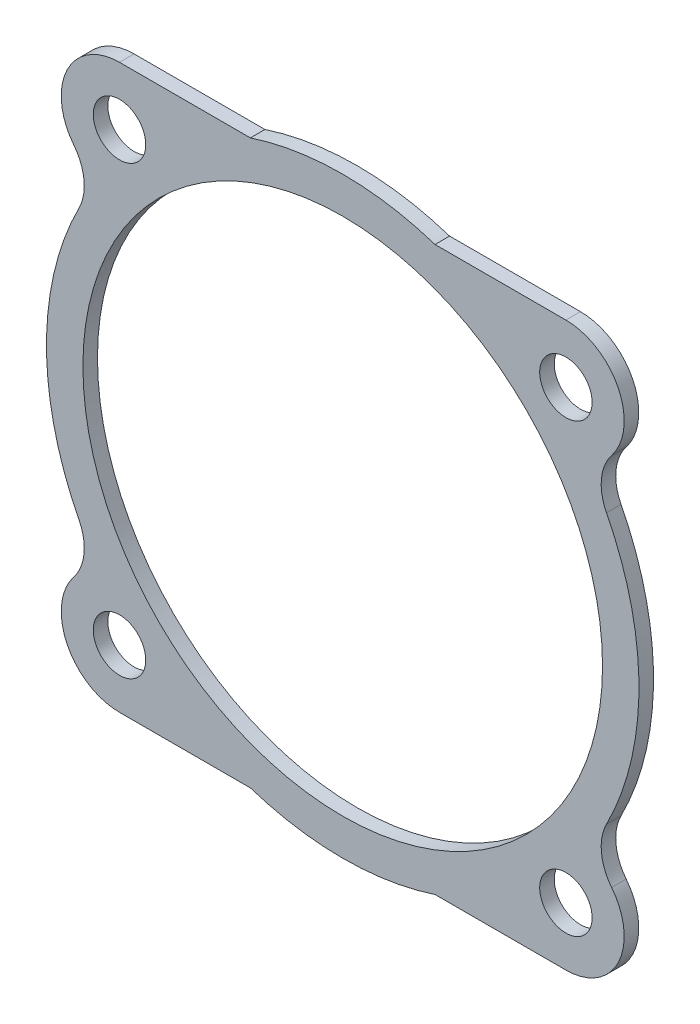
ISO-10303-21;
HEADER;
FILE_DESCRIPTION(('STEP AP214'),'2;1');
FILE_NAME('part.step','',(''),(''),'','','');
FILE_SCHEMA(('AUTOMOTIVE_DESIGN { 1 0 10303 214 1 1 1 1 }'));
ENDSEC;
DATA;
#1=APPLICATION_CONTEXT('core data for automotive mechanical design processes');
#2=APPLICATION_PROTOCOL_DEFINITION('international standard','automotive_design',2000,#1);
#3=PRODUCT_CONTEXT('',#1,'mechanical');
#4=PRODUCT('Part','Part','',(#3));
#5=PRODUCT_RELATED_PRODUCT_CATEGORY('part','',(#4));
#6=PRODUCT_DEFINITION_FORMATION('','',#4);
#7=PRODUCT_DEFINITION_CONTEXT('part definition',#1,'design');
#8=PRODUCT_DEFINITION('design','',#6,#7);
#9=PRODUCT_DEFINITION_SHAPE('','',#8);
#10=(LENGTH_UNIT() NAMED_UNIT(*) SI_UNIT(.MILLI.,.METRE.));
#11=(NAMED_UNIT(*) PLANE_ANGLE_UNIT() SI_UNIT($,.RADIAN.));
#12=(NAMED_UNIT(*) SI_UNIT($,.STERADIAN.) SOLID_ANGLE_UNIT());
#13=UNCERTAINTY_MEASURE_WITH_UNIT(LENGTH_MEASURE(1.E-05),#10,'distance_accuracy_value','');
#14=(GEOMETRIC_REPRESENTATION_CONTEXT(3) GLOBAL_UNCERTAINTY_ASSIGNED_CONTEXT((#13)) GLOBAL_UNIT_ASSIGNED_CONTEXT((#10,
#11,#12)) REPRESENTATION_CONTEXT('',''));
#15=CARTESIAN_POINT('',(0.,0.,0.));
#16=DIRECTION('',(0.,0.,1.));
#17=DIRECTION('',(1.,0.,0.));
#18=AXIS2_PLACEMENT_3D('',#15,#16,#17);
#19=CARTESIAN_POINT('',(0.,0.,0.750000000000001));
#20=DIRECTION('',(0.,0.,1.));
#21=DIRECTION('',(1.,0.,0.));
#22=AXIS2_PLACEMENT_3D('',#19,#20,#21);
#23=PLANE('',#22);
#24=CARTESIAN_POINT('',(11.4904851942815,11.4904851942813,0.750000000000006));
#25=DIRECTION('',(0.,0.,1.));
#26=DIRECTION('',(1.,0.,0.));
#27=AXIS2_PLACEMENT_3D('',#24,#25,#26);
#28=CIRCLE('',#27,1.35);
#29=CARTESIAN_POINT('',(12.8404851942815,11.4904851942813,0.750000000000006));
#30=VERTEX_POINT('',#29);
#31=EDGE_CURVE('E379',#30,#30,#28,.T.);
#32=ORIENTED_EDGE('',*,*,#31,.F.);
#33=EDGE_LOOP('',(#32));
#34=FACE_BOUND('',#33,.T.);
#35=CARTESIAN_POINT('',(-11.4904851942815,-11.4904851942813,0.749999999999995));
#36=DIRECTION('',(0.,0.,1.));
#37=DIRECTION('',(1.,0.,0.));
#38=AXIS2_PLACEMENT_3D('',#35,#36,#37);
#39=CIRCLE('',#38,1.35);
#40=CARTESIAN_POINT('',(-10.1404851942815,-11.4904851942813,0.749999999999995));
#41=VERTEX_POINT('',#40);
#42=EDGE_CURVE('E391',#41,#41,#39,.T.);
#43=ORIENTED_EDGE('',*,*,#42,.F.);
#44=EDGE_LOOP('',(#43));
#45=FACE_BOUND('',#44,.T.);
#46=CARTESIAN_POINT('',(0.,0.,0.750000000000001));
#47=DIRECTION('',(0.,0.,1.));
#48=DIRECTION('',(1.,0.,0.));
#49=AXIS2_PLACEMENT_3D('',#46,#47,#48);
#50=CIRCLE('',#49,15.25);
#51=CARTESIAN_POINT('',(4.75271909903301,14.4904851942813,0.750000000000001));
#52=VERTEX_POINT('',#51);
#53=CARTESIAN_POINT('',(-4.75271909903301,14.4904851942813,0.750000000000001));
#54=VERTEX_POINT('',#53);
#55=EDGE_CURVE('E196',#52,#54,#50,.T.);
#56=ORIENTED_EDGE('',*,*,#55,.T.);
#57=DIRECTION('',(-1.,0.,0.));
#58=VECTOR('',#57,1.);
#59=CARTESIAN_POINT('',(-4.75271909903301,14.4904851942813,0.750000000000001));
#60=LINE('',#59,#58);
#61=CARTESIAN_POINT('',(-11.4904851942815,14.4904851942813,0.750000000000001));
#62=VERTEX_POINT('',#61);
#63=EDGE_CURVE('E159',#54,#62,#60,.T.);
#64=ORIENTED_EDGE('',*,*,#63,.T.);
#65=CARTESIAN_POINT('',(-11.4904851942815,11.4904851942813,0.750000000000001));
#66=DIRECTION('',(0.,0.,1.));
#67=DIRECTION('',(1.,0.,0.));
#68=AXIS2_PLACEMENT_3D('',#65,#66,#67);
#69=CIRCLE('',#68,3.);
#70=CARTESIAN_POINT('',(-13.8437153322599,9.62975740180065,0.750000000000001));
#71=VERTEX_POINT('',#70);
#72=EDGE_CURVE('E199',#62,#71,#69,.T.);
#73=ORIENTED_EDGE('',*,*,#72,.T.);
#74=CARTESIAN_POINT('',(-15.8047404472421,8.07915090806675,0.750000000000001));
#75=DIRECTION('',(0.,0.,-1.));
#76=DIRECTION('',(1.,0.,0.));
#77=AXIS2_PLACEMENT_3D('',#74,#75,#76);
#78=CIRCLE('',#77,2.5);
#79=CARTESIAN_POINT('',(-13.5787206659402,6.9412423294658,0.750000000000001));
#80=VERTEX_POINT('',#79);
#81=EDGE_CURVE('E201',#71,#80,#78,.T.);
#82=ORIENTED_EDGE('',*,*,#81,.T.);
#83=CARTESIAN_POINT('',(0.,0.,0.750000000000001));
#84=DIRECTION('',(0.,0.,1.));
#85=DIRECTION('',(1.,0.,0.));
#86=AXIS2_PLACEMENT_3D('',#83,#84,#85);
#87=CIRCLE('',#86,15.25);
#88=CARTESIAN_POINT('',(-13.5787206659402,-6.9412423294658,0.750000000000001));
#89=VERTEX_POINT('',#88);
#90=EDGE_CURVE('E203',#80,#89,#87,.T.);
#91=ORIENTED_EDGE('',*,*,#90,.T.);
#92=CARTESIAN_POINT('',(-15.8047404472421,-8.07915090806676,0.750000000000001));
#93=DIRECTION('',(0.,0.,-1.));
#94=DIRECTION('',(1.,0.,0.));
#95=AXIS2_PLACEMENT_3D('',#92,#93,#94);
#96=CIRCLE('',#95,2.5);
#97=CARTESIAN_POINT('',(-13.8437153322599,-9.62975740180066,0.750000000000001));
#98=VERTEX_POINT('',#97);
#99=EDGE_CURVE('E205',#89,#98,#96,.T.);
#100=ORIENTED_EDGE('',*,*,#99,.T.);
#101=CARTESIAN_POINT('',(-11.4904851942815,-11.4904851942813,0.749999999999995));
#102=DIRECTION('',(0.,0.,1.));
#103=DIRECTION('',(1.,0.,0.));
#104=AXIS2_PLACEMENT_3D('',#101,#102,#103);
#105=CIRCLE('',#104,3.);
#106=CARTESIAN_POINT('',(-11.4904851942815,-14.4904851942813,0.750000000000001));
#107=VERTEX_POINT('',#106);
#108=EDGE_CURVE('E207',#98,#107,#105,.T.);
#109=ORIENTED_EDGE('',*,*,#108,.T.);
#110=DIRECTION('',(1.,0.,0.));
#111=VECTOR('',#110,1.);
#112=CARTESIAN_POINT('',(-11.4904851942815,-14.4904851942813,0.750000000000001));
#113=LINE('',#112,#111);
#114=CARTESIAN_POINT('',(-4.75271909903302,-14.4904851942813,0.750000000000001));
#115=VERTEX_POINT('',#114);
#116=EDGE_CURVE('E209',#107,#115,#113,.T.);
#117=ORIENTED_EDGE('',*,*,#116,.T.);
#118=CARTESIAN_POINT('',(0.,0.,0.750000000000001));
#119=DIRECTION('',(0.,0.,1.));
#120=DIRECTION('',(1.,0.,0.));
#121=AXIS2_PLACEMENT_3D('',#118,#119,#120);
#122=CIRCLE('',#121,15.25);
#123=CARTESIAN_POINT('',(4.75271909903301,-14.4904851942813,0.750000000000001));
#124=VERTEX_POINT('',#123);
#125=EDGE_CURVE('E211',#115,#124,#122,.T.);
#126=ORIENTED_EDGE('',*,*,#125,.T.);
#127=DIRECTION('',(1.,0.,0.));
#128=VECTOR('',#127,1.);
#129=CARTESIAN_POINT('',(4.75271909903301,-14.4904851942813,0.750000000000001));
#130=LINE('',#129,#128);
#131=CARTESIAN_POINT('',(11.4904851942815,-14.4904851942813,0.750000000000001));
#132=VERTEX_POINT('',#131);
#133=EDGE_CURVE('E213',#124,#132,#130,.T.);
#134=ORIENTED_EDGE('',*,*,#133,.T.);
#135=CARTESIAN_POINT('',(11.4904851942815,-11.4904851942813,0.750000000000001));
#136=DIRECTION('',(0.,0.,1.));
#137=DIRECTION('',(1.,0.,0.));
#138=AXIS2_PLACEMENT_3D('',#135,#136,#137);
#139=CIRCLE('',#138,3.);
#140=CARTESIAN_POINT('',(13.8437153322599,-9.62975740180066,0.750000000000001));
#141=VERTEX_POINT('',#140);
#142=EDGE_CURVE('E215',#132,#141,#139,.T.);
#143=ORIENTED_EDGE('',*,*,#142,.T.);
#144=CARTESIAN_POINT('',(15.8047404472417,-8.07915090806676,0.750000000000001));
#145=DIRECTION('',(0.,0.,-1.));
#146=DIRECTION('',(1.,0.,0.));
#147=AXIS2_PLACEMENT_3D('',#144,#145,#146);
#148=CIRCLE('',#147,2.5);
#149=CARTESIAN_POINT('',(13.5787206659402,-6.9412423294658,0.750000000000001));
#150=VERTEX_POINT('',#149);
#151=EDGE_CURVE('E217',#141,#150,#148,.T.);
#152=ORIENTED_EDGE('',*,*,#151,.T.);
#153=CARTESIAN_POINT('',(0.,0.,0.750000000000001));
#154=DIRECTION('',(0.,0.,1.));
#155=DIRECTION('',(1.,0.,0.));
#156=AXIS2_PLACEMENT_3D('',#153,#154,#155);
#157=CIRCLE('',#156,15.25);
#158=CARTESIAN_POINT('',(13.5787206659402,6.9412423294658,0.750000000000001));
#159=VERTEX_POINT('',#158);
#160=EDGE_CURVE('E219',#150,#159,#157,.T.);
#161=ORIENTED_EDGE('',*,*,#160,.T.);
#162=CARTESIAN_POINT('',(15.8047404472417,8.07915090806675,0.750000000000001));
#163=DIRECTION('',(0.,0.,-1.));
#164=DIRECTION('',(1.,0.,0.));
#165=AXIS2_PLACEMENT_3D('',#162,#163,#164);
#166=CIRCLE('',#165,2.5);
#167=CARTESIAN_POINT('',(13.8437153322599,9.62975740180066,0.750000000000001));
#168=VERTEX_POINT('',#167);
#169=EDGE_CURVE('E221',#159,#168,#166,.T.);
#170=ORIENTED_EDGE('',*,*,#169,.T.);
#171=CARTESIAN_POINT('',(11.4904851942815,11.4904851942813,0.750000000000006));
#172=DIRECTION('',(0.,0.,1.));
#173=DIRECTION('',(1.,0.,0.));
#174=AXIS2_PLACEMENT_3D('',#171,#172,#173);
#175=CIRCLE('',#174,3.);
#176=CARTESIAN_POINT('',(11.4904851942815,14.4904851942813,0.750000000000001));
#177=VERTEX_POINT('',#176);
#178=EDGE_CURVE('E52',#168,#177,#175,.T.);
#179=ORIENTED_EDGE('',*,*,#178,.T.);
#180=DIRECTION('',(-1.,0.,0.));
#181=VECTOR('',#180,1.);
#182=CARTESIAN_POINT('',(11.4904851942815,14.4904851942813,0.750000000000001));
#183=LINE('',#182,#181);
#184=EDGE_CURVE('E47',#177,#52,#183,.T.);
#185=ORIENTED_EDGE('',*,*,#184,.T.);
#186=EDGE_LOOP('',(#56,#64,#73,#82,#91,#100,#109,#117,#126,#134,#143,#152,#161,#170,#179,#185));
#187=FACE_BOUND('',#186,.T.);
#188=CARTESIAN_POINT('',(0.,0.,0.750000000000001));
#189=DIRECTION('',(0.,0.,1.));
#190=DIRECTION('',(1.,0.,0.));
#191=AXIS2_PLACEMENT_3D('',#188,#189,#190);
#192=CIRCLE('',#191,13.375);
#193=CARTESIAN_POINT('',(13.375,0.,0.750000000000001));
#194=VERTEX_POINT('',#193);
#195=EDGE_CURVE('E153',#194,#194,#192,.T.);
#196=ORIENTED_EDGE('',*,*,#195,.F.);
#197=EDGE_LOOP('',(#196));
#198=FACE_BOUND('',#197,.T.);
#199=CARTESIAN_POINT('',(-11.4904851942815,11.4904851942813,0.750000000000001));
#200=DIRECTION('',(0.,0.,1.));
#201=DIRECTION('',(1.,0.,0.));
#202=AXIS2_PLACEMENT_3D('',#199,#200,#201);
#203=CIRCLE('',#202,1.35);
#204=CARTESIAN_POINT('',(-10.1404851942815,11.4904851942813,0.750000000000001));
#205=VERTEX_POINT('',#204);
#206=EDGE_CURVE('E385',#205,#205,#203,.T.);
#207=ORIENTED_EDGE('',*,*,#206,.F.);
#208=EDGE_LOOP('',(#207));
#209=FACE_BOUND('',#208,.T.);
#210=CARTESIAN_POINT('',(11.4904851942815,-11.4904851942813,0.750000000000001));
#211=DIRECTION('',(0.,0.,1.));
#212=DIRECTION('',(1.,0.,0.));
#213=AXIS2_PLACEMENT_3D('',#210,#211,#212);
#214=CIRCLE('',#213,1.35);
#215=CARTESIAN_POINT('',(12.8404851942815,-11.4904851942813,0.750000000000001));
#216=VERTEX_POINT('',#215);
#217=EDGE_CURVE('E368',#216,#216,#214,.T.);
#218=ORIENTED_EDGE('',*,*,#217,.F.);
#219=EDGE_LOOP('',(#218));
#220=FACE_BOUND('',#219,.T.);
#221=ADVANCED_FACE('F32',(#34,#45,#187,#198,#209,#220),#23,.T.);
#222=CARTESIAN_POINT('',(0.,0.,0.));
#223=DIRECTION('',(0.,0.,1.));
#224=DIRECTION('',(1.,0.,0.));
#225=AXIS2_PLACEMENT_3D('',#222,#223,#224);
#226=PLANE('',#225);
#227=CARTESIAN_POINT('',(11.4904851942815,11.4904851942813,0.));
#228=DIRECTION('',(0.,0.,1.));
#229=DIRECTION('',(1.,0.,0.));
#230=AXIS2_PLACEMENT_3D('',#227,#228,#229);
#231=CIRCLE('',#230,1.35);
#232=CARTESIAN_POINT('',(12.8404851942815,11.4904851942813,0.));
#233=VERTEX_POINT('',#232);
#234=EDGE_CURVE('E374',#233,#233,#231,.T.);
#235=ORIENTED_EDGE('',*,*,#234,.T.);
#236=EDGE_LOOP('',(#235));
#237=FACE_BOUND('',#236,.T.);
#238=CARTESIAN_POINT('',(-11.4904851942815,-11.4904851942813,0.));
#239=DIRECTION('',(0.,0.,1.));
#240=DIRECTION('',(1.,0.,0.));
#241=AXIS2_PLACEMENT_3D('',#238,#239,#240);
#242=CIRCLE('',#241,1.35);
#243=CARTESIAN_POINT('',(-10.1404851942815,-11.4904851942813,0.));
#244=VERTEX_POINT('',#243);
#245=EDGE_CURVE('E388',#244,#244,#242,.T.);
#246=ORIENTED_EDGE('',*,*,#245,.T.);
#247=EDGE_LOOP('',(#246));
#248=FACE_BOUND('',#247,.T.);
#249=CARTESIAN_POINT('',(0.,0.,0.));
#250=DIRECTION('',(0.,0.,1.));
#251=DIRECTION('',(1.,0.,0.));
#252=AXIS2_PLACEMENT_3D('',#249,#250,#251);
#253=CIRCLE('',#252,15.25);
#254=CARTESIAN_POINT('',(4.75271909903301,14.4904851942813,0.));
#255=VERTEX_POINT('',#254);
#256=CARTESIAN_POINT('',(-4.75271909903301,14.4904851942813,0.));
#257=VERTEX_POINT('',#256);
#258=EDGE_CURVE('E144',#255,#257,#253,.T.);
#259=ORIENTED_EDGE('',*,*,#258,.F.);
#260=DIRECTION('',(-1.,0.,0.));
#261=VECTOR('',#260,1.);
#262=CARTESIAN_POINT('',(11.4904851942815,14.4904851942813,0.));
#263=LINE('',#262,#261);
#264=CARTESIAN_POINT('',(11.4904851942815,14.4904851942813,0.));
#265=VERTEX_POINT('',#264);
#266=EDGE_CURVE('E194',#265,#255,#263,.T.);
#267=ORIENTED_EDGE('',*,*,#266,.F.);
#268=CARTESIAN_POINT('',(11.4904851942815,11.4904851942813,0.));
#269=DIRECTION('',(0.,0.,1.));
#270=DIRECTION('',(1.,0.,0.));
#271=AXIS2_PLACEMENT_3D('',#268,#269,#270);
#272=CIRCLE('',#271,3.);
#273=CARTESIAN_POINT('',(13.8437153322599,9.62975740180066,0.));
#274=VERTEX_POINT('',#273);
#275=EDGE_CURVE('E192',#274,#265,#272,.T.);
#276=ORIENTED_EDGE('',*,*,#275,.F.);
#277=CARTESIAN_POINT('',(15.8047404472417,8.07915090806675,0.));
#278=DIRECTION('',(0.,0.,-1.));
#279=DIRECTION('',(1.,0.,0.));
#280=AXIS2_PLACEMENT_3D('',#277,#278,#279);
#281=CIRCLE('',#280,2.5);
#282=CARTESIAN_POINT('',(13.5787206659402,6.9412423294658,0.));
#283=VERTEX_POINT('',#282);
#284=EDGE_CURVE('E190',#283,#274,#281,.T.);
#285=ORIENTED_EDGE('',*,*,#284,.F.);
#286=CARTESIAN_POINT('',(0.,0.,0.));
#287=DIRECTION('',(0.,0.,1.));
#288=DIRECTION('',(1.,0.,0.));
#289=AXIS2_PLACEMENT_3D('',#286,#287,#288);
#290=CIRCLE('',#289,15.25);
#291=CARTESIAN_POINT('',(13.5787206659402,-6.9412423294658,0.));
#292=VERTEX_POINT('',#291);
#293=EDGE_CURVE('E188',#292,#283,#290,.T.);
#294=ORIENTED_EDGE('',*,*,#293,.F.);
#295=CARTESIAN_POINT('',(15.8047404472417,-8.07915090806676,0.));
#296=DIRECTION('',(0.,0.,-1.));
#297=DIRECTION('',(1.,0.,0.));
#298=AXIS2_PLACEMENT_3D('',#295,#296,#297);
#299=CIRCLE('',#298,2.5);
#300=CARTESIAN_POINT('',(13.8437153322599,-9.62975740180066,0.));
#301=VERTEX_POINT('',#300);
#302=EDGE_CURVE('E186',#301,#292,#299,.T.);
#303=ORIENTED_EDGE('',*,*,#302,.F.);
#304=CARTESIAN_POINT('',(11.4904851942815,-11.4904851942813,0.));
#305=DIRECTION('',(0.,0.,1.));
#306=DIRECTION('',(1.,0.,0.));
#307=AXIS2_PLACEMENT_3D('',#304,#305,#306);
#308=CIRCLE('',#307,3.);
#309=CARTESIAN_POINT('',(11.4904851942815,-14.4904851942813,0.));
#310=VERTEX_POINT('',#309);
#311=EDGE_CURVE('E184',#310,#301,#308,.T.);
#312=ORIENTED_EDGE('',*,*,#311,.F.);
#313=DIRECTION('',(1.,0.,0.));
#314=VECTOR('',#313,1.);
#315=CARTESIAN_POINT('',(4.75271909903301,-14.4904851942813,0.));
#316=LINE('',#315,#314);
#317=CARTESIAN_POINT('',(4.75271909903301,-14.4904851942813,0.));
#318=VERTEX_POINT('',#317);
#319=EDGE_CURVE('E182',#318,#310,#316,.T.);
#320=ORIENTED_EDGE('',*,*,#319,.F.);
#321=CARTESIAN_POINT('',(0.,0.,0.));
#322=DIRECTION('',(0.,0.,1.));
#323=DIRECTION('',(1.,0.,0.));
#324=AXIS2_PLACEMENT_3D('',#321,#322,#323);
#325=CIRCLE('',#324,15.25);
#326=CARTESIAN_POINT('',(-4.75271909903302,-14.4904851942813,0.));
#327=VERTEX_POINT('',#326);
#328=EDGE_CURVE('E180',#327,#318,#325,.T.);
#329=ORIENTED_EDGE('',*,*,#328,.F.);
#330=DIRECTION('',(1.,0.,0.));
#331=VECTOR('',#330,1.);
#332=CARTESIAN_POINT('',(-11.4904851942815,-14.4904851942813,0.));
#333=LINE('',#332,#331);
#334=CARTESIAN_POINT('',(-11.4904851942815,-14.4904851942813,0.));
#335=VERTEX_POINT('',#334);
#336=EDGE_CURVE('E178',#335,#327,#333,.T.);
#337=ORIENTED_EDGE('',*,*,#336,.F.);
#338=CARTESIAN_POINT('',(-11.4904851942815,-11.4904851942813,0.));
#339=DIRECTION('',(0.,0.,1.));
#340=DIRECTION('',(1.,0.,0.));
#341=AXIS2_PLACEMENT_3D('',#338,#339,#340);
#342=CIRCLE('',#341,3.);
#343=CARTESIAN_POINT('',(-13.8437153322599,-9.62975740180066,0.));
#344=VERTEX_POINT('',#343);
#345=EDGE_CURVE('E176',#344,#335,#342,.T.);
#346=ORIENTED_EDGE('',*,*,#345,.F.);
#347=CARTESIAN_POINT('',(-15.8047404472421,-8.07915090806676,0.));
#348=DIRECTION('',(0.,0.,-1.));
#349=DIRECTION('',(1.,0.,0.));
#350=AXIS2_PLACEMENT_3D('',#347,#348,#349);
#351=CIRCLE('',#350,2.5);
#352=CARTESIAN_POINT('',(-13.5787206659402,-6.9412423294658,0.));
#353=VERTEX_POINT('',#352);
#354=EDGE_CURVE('E174',#353,#344,#351,.T.);
#355=ORIENTED_EDGE('',*,*,#354,.F.);
#356=CARTESIAN_POINT('',(0.,0.,0.));
#357=DIRECTION('',(0.,0.,1.));
#358=DIRECTION('',(1.,0.,0.));
#359=AXIS2_PLACEMENT_3D('',#356,#357,#358);
#360=CIRCLE('',#359,15.25);
#361=CARTESIAN_POINT('',(-13.5787206659402,6.9412423294658,0.));
#362=VERTEX_POINT('',#361);
#363=EDGE_CURVE('E172',#362,#353,#360,.T.);
#364=ORIENTED_EDGE('',*,*,#363,.F.);
#365=CARTESIAN_POINT('',(-15.8047404472421,8.07915090806675,0.));
#366=DIRECTION('',(0.,0.,-1.));
#367=DIRECTION('',(1.,0.,0.));
#368=AXIS2_PLACEMENT_3D('',#365,#366,#367);
#369=CIRCLE('',#368,2.5);
#370=CARTESIAN_POINT('',(-13.8437153322599,9.62975740180065,0.));
#371=VERTEX_POINT('',#370);
#372=EDGE_CURVE('E166',#371,#362,#369,.T.);
#373=ORIENTED_EDGE('',*,*,#372,.F.);
#374=CARTESIAN_POINT('',(-11.4904851942815,11.4904851942813,0.));
#375=DIRECTION('',(0.,0.,1.));
#376=DIRECTION('',(1.,0.,0.));
#377=AXIS2_PLACEMENT_3D('',#374,#375,#376);
#378=CIRCLE('',#377,3.);
#379=CARTESIAN_POINT('',(-11.4904851942815,14.4904851942813,0.));
#380=VERTEX_POINT('',#379);
#381=EDGE_CURVE('E164',#380,#371,#378,.T.);
#382=ORIENTED_EDGE('',*,*,#381,.F.);
#383=DIRECTION('',(-1.,0.,0.));
#384=VECTOR('',#383,1.);
#385=CARTESIAN_POINT('',(-4.75271909903301,14.4904851942813,0.));
#386=LINE('',#385,#384);
#387=EDGE_CURVE('E152',#257,#380,#386,.T.);
#388=ORIENTED_EDGE('',*,*,#387,.F.);
#389=EDGE_LOOP('',(#259,#267,#276,#285,#294,#303,#312,#320,#329,#337,#346,#355,#364,#373,#382,#388));
#390=FACE_BOUND('',#389,.T.);
#391=CARTESIAN_POINT('',(0.,0.,0.));
#392=DIRECTION('',(0.,0.,1.));
#393=DIRECTION('',(1.,0.,0.));
#394=AXIS2_PLACEMENT_3D('',#391,#392,#393);
#395=CIRCLE('',#394,13.375);
#396=CARTESIAN_POINT('',(13.375,0.,0.));
#397=VERTEX_POINT('',#396);
#398=EDGE_CURVE('E394',#397,#397,#395,.T.);
#399=ORIENTED_EDGE('',*,*,#398,.T.);
#400=EDGE_LOOP('',(#399));
#401=FACE_BOUND('',#400,.T.);
#402=CARTESIAN_POINT('',(-11.4904851942815,11.4904851942813,0.));
#403=DIRECTION('',(0.,0.,1.));
#404=DIRECTION('',(1.,0.,0.));
#405=AXIS2_PLACEMENT_3D('',#402,#403,#404);
#406=CIRCLE('',#405,1.35);
#407=CARTESIAN_POINT('',(-10.1404851942815,11.4904851942813,0.));
#408=VERTEX_POINT('',#407);
#409=EDGE_CURVE('E382',#408,#408,#406,.T.);
#410=ORIENTED_EDGE('',*,*,#409,.T.);
#411=EDGE_LOOP('',(#410));
#412=FACE_BOUND('',#411,.T.);
#413=CARTESIAN_POINT('',(11.4904851942815,-11.4904851942813,0.));
#414=DIRECTION('',(0.,0.,1.));
#415=DIRECTION('',(1.,0.,0.));
#416=AXIS2_PLACEMENT_3D('',#413,#414,#415);
#417=CIRCLE('',#416,1.35);
#418=CARTESIAN_POINT('',(12.8404851942815,-11.4904851942813,0.));
#419=VERTEX_POINT('',#418);
#420=EDGE_CURVE('E371',#419,#419,#417,.T.);
#421=ORIENTED_EDGE('',*,*,#420,.T.);
#422=EDGE_LOOP('',(#421));
#423=FACE_BOUND('',#422,.T.);
#424=ADVANCED_FACE('F161',(#237,#248,#390,#401,#412,#423),#226,.F.);
#425=CARTESIAN_POINT('',(0.,0.,0.750000000000001));
#426=DIRECTION('',(0.,0.,-1.));
#427=DIRECTION('',(-1.,0.,0.));
#428=AXIS2_PLACEMENT_3D('',#425,#426,#427);
#429=CYLINDRICAL_SURFACE('',#428,15.25);
#430=ORIENTED_EDGE('',*,*,#258,.T.);
#431=DIRECTION('',(0.,0.,-1.));
#432=VECTOR('',#431,1.);
#433=CARTESIAN_POINT('',(-4.75271909903301,14.4904851942813,0.750000000000001));
#434=LINE('',#433,#432);
#435=EDGE_CURVE('E11',#54,#257,#434,.T.);
#436=ORIENTED_EDGE('',*,*,#435,.F.);
#437=ORIENTED_EDGE('',*,*,#55,.F.);
#438=DIRECTION('',(0.,0.,-1.));
#439=VECTOR('',#438,1.);
#440=CARTESIAN_POINT('',(4.75271909903301,14.4904851942813,0.750000000000001));
#441=LINE('',#440,#439);
#442=EDGE_CURVE('E147',#52,#255,#441,.T.);
#443=ORIENTED_EDGE('',*,*,#442,.T.);
#444=EDGE_LOOP('',(#430,#436,#437,#443));
#445=FACE_BOUND('',#444,.T.);
#446=ADVANCED_FACE('F34',(#445),#429,.T.);
#447=CARTESIAN_POINT('',(-4.75271909903301,14.4904851942813,0.750000000000001));
#448=DIRECTION('',(0.,-1.,0.));
#449=DIRECTION('',(1.,0.,0.));
#450=AXIS2_PLACEMENT_3D('',#447,#448,#449);
#451=PLANE('',#450);
#452=ORIENTED_EDGE('',*,*,#387,.T.);
#453=DIRECTION('',(0.,0.,-1.));
#454=VECTOR('',#453,1.);
#455=CARTESIAN_POINT('',(-11.4904851942815,14.4904851942813,0.750000000000001));
#456=LINE('',#455,#454);
#457=EDGE_CURVE('E40',#62,#380,#456,.T.);
#458=ORIENTED_EDGE('',*,*,#457,.F.);
#459=ORIENTED_EDGE('',*,*,#63,.F.);
#460=ORIENTED_EDGE('',*,*,#435,.T.);
#461=EDGE_LOOP('',(#452,#458,#459,#460));
#462=FACE_BOUND('',#461,.T.);
#463=ADVANCED_FACE('F156',(#462),#451,.F.);
#464=CARTESIAN_POINT('',(-11.4904851942815,11.4904851942813,0.750000000000001));
#465=DIRECTION('',(0.,0.,-1.));
#466=DIRECTION('',(-1.,0.,0.));
#467=AXIS2_PLACEMENT_3D('',#464,#465,#466);
#468=CYLINDRICAL_SURFACE('',#467,3.);
#469=ORIENTED_EDGE('',*,*,#381,.T.);
#470=DIRECTION('',(0.,0.,-1.));
#471=VECTOR('',#470,1.);
#472=CARTESIAN_POINT('',(-13.8437153322599,9.62975740180065,0.750000000000001));
#473=LINE('',#472,#471);
#474=EDGE_CURVE('E262',#71,#371,#473,.T.);
#475=ORIENTED_EDGE('',*,*,#474,.F.);
#476=ORIENTED_EDGE('',*,*,#72,.F.);
#477=ORIENTED_EDGE('',*,*,#457,.T.);
#478=EDGE_LOOP('',(#469,#475,#476,#477));
#479=FACE_BOUND('',#478,.T.);
#480=ADVANCED_FACE('F266',(#479),#468,.T.);
#481=CARTESIAN_POINT('',(-15.8047404472421,8.07915090806675,0.750000000000001));
#482=DIRECTION('',(0.,0.,-1.));
#483=DIRECTION('',(-1.,0.,0.));
#484=AXIS2_PLACEMENT_3D('',#481,#482,#483);
#485=CYLINDRICAL_SURFACE('',#484,2.5);
#486=ORIENTED_EDGE('',*,*,#372,.T.);
#487=DIRECTION('',(0.,0.,-1.));
#488=VECTOR('',#487,1.);
#489=CARTESIAN_POINT('',(-13.5787206659402,6.9412423294658,0.750000000000001));
#490=LINE('',#489,#488);
#491=EDGE_CURVE('E259',#80,#362,#490,.T.);
#492=ORIENTED_EDGE('',*,*,#491,.F.);
#493=ORIENTED_EDGE('',*,*,#81,.F.);
#494=ORIENTED_EDGE('',*,*,#474,.T.);
#495=EDGE_LOOP('',(#486,#492,#493,#494));
#496=FACE_BOUND('',#495,.T.);
#497=ADVANCED_FACE('F274',(#496),#485,.F.);
#498=CARTESIAN_POINT('',(0.,0.,0.750000000000001));
#499=DIRECTION('',(0.,0.,-1.));
#500=DIRECTION('',(-1.,0.,0.));
#501=AXIS2_PLACEMENT_3D('',#498,#499,#500);
#502=CYLINDRICAL_SURFACE('',#501,15.25);
#503=ORIENTED_EDGE('',*,*,#363,.T.);
#504=DIRECTION('',(0.,0.,-1.));
#505=VECTOR('',#504,1.);
#506=CARTESIAN_POINT('',(-13.5787206659402,-6.9412423294658,0.750000000000001));
#507=LINE('',#506,#505);
#508=EDGE_CURVE('E256',#89,#353,#507,.T.);
#509=ORIENTED_EDGE('',*,*,#508,.F.);
#510=ORIENTED_EDGE('',*,*,#90,.F.);
#511=ORIENTED_EDGE('',*,*,#491,.T.);
#512=EDGE_LOOP('',(#503,#509,#510,#511));
#513=FACE_BOUND('',#512,.T.);
#514=ADVANCED_FACE('F276',(#513),#502,.T.);
#515=CARTESIAN_POINT('',(-15.8047404472421,-8.07915090806676,0.750000000000001));
#516=DIRECTION('',(0.,0.,-1.));
#517=DIRECTION('',(-1.,0.,0.));
#518=AXIS2_PLACEMENT_3D('',#515,#516,#517);
#519=CYLINDRICAL_SURFACE('',#518,2.5);
#520=ORIENTED_EDGE('',*,*,#354,.T.);
#521=DIRECTION('',(0.,0.,-1.));
#522=VECTOR('',#521,1.);
#523=CARTESIAN_POINT('',(-13.8437153322599,-9.62975740180066,0.750000000000001));
#524=LINE('',#523,#522);
#525=EDGE_CURVE('E253',#98,#344,#524,.T.);
#526=ORIENTED_EDGE('',*,*,#525,.F.);
#527=ORIENTED_EDGE('',*,*,#99,.F.);
#528=ORIENTED_EDGE('',*,*,#508,.T.);
#529=EDGE_LOOP('',(#520,#526,#527,#528));
#530=FACE_BOUND('',#529,.T.);
#531=ADVANCED_FACE('F281',(#530),#519,.F.);
#532=CARTESIAN_POINT('',(-11.4904851942815,-11.4904851942813,0.749999999999995));
#533=DIRECTION('',(0.,0.,-1.));
#534=DIRECTION('',(-1.,0.,0.));
#535=AXIS2_PLACEMENT_3D('',#532,#533,#534);
#536=CYLINDRICAL_SURFACE('',#535,3.);
#537=ORIENTED_EDGE('',*,*,#345,.T.);
#538=DIRECTION('',(0.,0.,-1.));
#539=VECTOR('',#538,1.);
#540=CARTESIAN_POINT('',(-11.4904851942815,-14.4904851942813,0.750000000000001));
#541=LINE('',#540,#539);
#542=EDGE_CURVE('E250',#107,#335,#541,.T.);
#543=ORIENTED_EDGE('',*,*,#542,.F.);
#544=ORIENTED_EDGE('',*,*,#108,.F.);
#545=ORIENTED_EDGE('',*,*,#525,.T.);
#546=EDGE_LOOP('',(#537,#543,#544,#545));
#547=FACE_BOUND('',#546,.T.);
#548=ADVANCED_FACE('F287',(#547),#536,.T.);
#549=CARTESIAN_POINT('',(-11.4904851942815,-14.4904851942813,0.750000000000001));
#550=DIRECTION('',(0.,1.,0.));
#551=DIRECTION('',(-1.,0.,0.));
#552=AXIS2_PLACEMENT_3D('',#549,#550,#551);
#553=PLANE('',#552);
#554=ORIENTED_EDGE('',*,*,#336,.T.);
#555=DIRECTION('',(0.,0.,-1.));
#556=VECTOR('',#555,1.);
#557=CARTESIAN_POINT('',(-4.75271909903302,-14.4904851942813,0.750000000000001));
#558=LINE('',#557,#556);
#559=EDGE_CURVE('E247',#115,#327,#558,.T.);
#560=ORIENTED_EDGE('',*,*,#559,.F.);
#561=ORIENTED_EDGE('',*,*,#116,.F.);
#562=ORIENTED_EDGE('',*,*,#542,.T.);
#563=EDGE_LOOP('',(#554,#560,#561,#562));
#564=FACE_BOUND('',#563,.T.);
#565=ADVANCED_FACE('F291',(#564),#553,.F.);
#566=CARTESIAN_POINT('',(0.,0.,0.750000000000001));
#567=DIRECTION('',(0.,0.,-1.));
#568=DIRECTION('',(-1.,0.,0.));
#569=AXIS2_PLACEMENT_3D('',#566,#567,#568);
#570=CYLINDRICAL_SURFACE('',#569,15.25);
#571=ORIENTED_EDGE('',*,*,#328,.T.);
#572=DIRECTION('',(0.,0.,-1.));
#573=VECTOR('',#572,1.);
#574=CARTESIAN_POINT('',(4.75271909903301,-14.4904851942813,0.750000000000001));
#575=LINE('',#574,#573);
#576=EDGE_CURVE('E244',#124,#318,#575,.T.);
#577=ORIENTED_EDGE('',*,*,#576,.F.);
#578=ORIENTED_EDGE('',*,*,#125,.F.);
#579=ORIENTED_EDGE('',*,*,#559,.T.);
#580=EDGE_LOOP('',(#571,#577,#578,#579));
#581=FACE_BOUND('',#580,.T.);
#582=ADVANCED_FACE('F296',(#581),#570,.T.);
#583=CARTESIAN_POINT('',(4.75271909903301,-14.4904851942813,0.750000000000001));
#584=DIRECTION('',(0.,1.,0.));
#585=DIRECTION('',(-1.,0.,0.));
#586=AXIS2_PLACEMENT_3D('',#583,#584,#585);
#587=PLANE('',#586);
#588=ORIENTED_EDGE('',*,*,#319,.T.);
#589=DIRECTION('',(0.,0.,-1.));
#590=VECTOR('',#589,1.);
#591=CARTESIAN_POINT('',(11.4904851942815,-14.4904851942813,0.750000000000001));
#592=LINE('',#591,#590);
#593=EDGE_CURVE('E241',#132,#310,#592,.T.);
#594=ORIENTED_EDGE('',*,*,#593,.F.);
#595=ORIENTED_EDGE('',*,*,#133,.F.);
#596=ORIENTED_EDGE('',*,*,#576,.T.);
#597=EDGE_LOOP('',(#588,#594,#595,#596));
#598=FACE_BOUND('',#597,.T.);
#599=ADVANCED_FACE('F302',(#598),#587,.F.);
#600=CARTESIAN_POINT('',(11.4904851942815,-11.4904851942813,0.750000000000001));
#601=DIRECTION('',(0.,0.,-1.));
#602=DIRECTION('',(-1.,0.,0.));
#603=AXIS2_PLACEMENT_3D('',#600,#601,#602);
#604=CYLINDRICAL_SURFACE('',#603,3.);
#605=ORIENTED_EDGE('',*,*,#311,.T.);
#606=DIRECTION('',(0.,0.,-1.));
#607=VECTOR('',#606,1.);
#608=CARTESIAN_POINT('',(13.8437153322599,-9.62975740180066,0.750000000000001));
#609=LINE('',#608,#607);
#610=EDGE_CURVE('E238',#141,#301,#609,.T.);
#611=ORIENTED_EDGE('',*,*,#610,.F.);
#612=ORIENTED_EDGE('',*,*,#142,.F.);
#613=ORIENTED_EDGE('',*,*,#593,.T.);
#614=EDGE_LOOP('',(#605,#611,#612,#613));
#615=FACE_BOUND('',#614,.T.);
#616=ADVANCED_FACE('F306',(#615),#604,.T.);
#617=CARTESIAN_POINT('',(15.8047404472417,-8.07915090806676,0.750000000000001));
#618=DIRECTION('',(0.,0.,-1.));
#619=DIRECTION('',(-1.,0.,0.));
#620=AXIS2_PLACEMENT_3D('',#617,#618,#619);
#621=CYLINDRICAL_SURFACE('',#620,2.5);
#622=ORIENTED_EDGE('',*,*,#302,.T.);
#623=DIRECTION('',(0.,0.,-1.));
#624=VECTOR('',#623,1.);
#625=CARTESIAN_POINT('',(13.5787206659402,-6.9412423294658,0.750000000000001));
#626=LINE('',#625,#624);
#627=EDGE_CURVE('E235',#150,#292,#626,.T.);
#628=ORIENTED_EDGE('',*,*,#627,.F.);
#629=ORIENTED_EDGE('',*,*,#151,.F.);
#630=ORIENTED_EDGE('',*,*,#610,.T.);
#631=EDGE_LOOP('',(#622,#628,#629,#630));
#632=FACE_BOUND('',#631,.T.);
#633=ADVANCED_FACE('F311',(#632),#621,.F.);
#634=CARTESIAN_POINT('',(0.,0.,0.750000000000001));
#635=DIRECTION('',(0.,0.,-1.));
#636=DIRECTION('',(-1.,0.,0.));
#637=AXIS2_PLACEMENT_3D('',#634,#635,#636);
#638=CYLINDRICAL_SURFACE('',#637,15.25);
#639=ORIENTED_EDGE('',*,*,#293,.T.);
#640=DIRECTION('',(0.,0.,-1.));
#641=VECTOR('',#640,1.);
#642=CARTESIAN_POINT('',(13.5787206659402,6.9412423294658,0.750000000000001));
#643=LINE('',#642,#641);
#644=EDGE_CURVE('E232',#159,#283,#643,.T.);
#645=ORIENTED_EDGE('',*,*,#644,.F.);
#646=ORIENTED_EDGE('',*,*,#160,.F.);
#647=ORIENTED_EDGE('',*,*,#627,.T.);
#648=EDGE_LOOP('',(#639,#645,#646,#647));
#649=FACE_BOUND('',#648,.T.);
#650=ADVANCED_FACE('F317',(#649),#638,.T.);
#651=CARTESIAN_POINT('',(15.8047404472417,8.07915090806675,0.750000000000001));
#652=DIRECTION('',(0.,0.,-1.));
#653=DIRECTION('',(-1.,0.,0.));
#654=AXIS2_PLACEMENT_3D('',#651,#652,#653);
#655=CYLINDRICAL_SURFACE('',#654,2.5);
#656=ORIENTED_EDGE('',*,*,#284,.T.);
#657=DIRECTION('',(0.,0.,-1.));
#658=VECTOR('',#657,1.);
#659=CARTESIAN_POINT('',(13.8437153322599,9.62975740180066,0.750000000000001));
#660=LINE('',#659,#658);
#661=EDGE_CURVE('E229',#168,#274,#660,.T.);
#662=ORIENTED_EDGE('',*,*,#661,.F.);
#663=ORIENTED_EDGE('',*,*,#169,.F.);
#664=ORIENTED_EDGE('',*,*,#644,.T.);
#665=EDGE_LOOP('',(#656,#662,#663,#664));
#666=FACE_BOUND('',#665,.T.);
#667=ADVANCED_FACE('F321',(#666),#655,.F.);
#668=CARTESIAN_POINT('',(11.4904851942815,11.4904851942813,0.750000000000006));
#669=DIRECTION('',(0.,0.,-1.));
#670=DIRECTION('',(-1.,0.,0.));
#671=AXIS2_PLACEMENT_3D('',#668,#669,#670);
#672=CYLINDRICAL_SURFACE('',#671,3.);
#673=ORIENTED_EDGE('',*,*,#275,.T.);
#674=DIRECTION('',(0.,0.,-1.));
#675=VECTOR('',#674,1.);
#676=CARTESIAN_POINT('',(11.4904851942815,14.4904851942813,0.750000000000001));
#677=LINE('',#676,#675);
#678=EDGE_CURVE('E226',#177,#265,#677,.T.);
#679=ORIENTED_EDGE('',*,*,#678,.F.);
#680=ORIENTED_EDGE('',*,*,#178,.F.);
#681=ORIENTED_EDGE('',*,*,#661,.T.);
#682=EDGE_LOOP('',(#673,#679,#680,#681));
#683=FACE_BOUND('',#682,.T.);
#684=ADVANCED_FACE('F324',(#683),#672,.T.);
#685=CARTESIAN_POINT('',(11.4904851942815,14.4904851942813,0.750000000000001));
#686=DIRECTION('',(0.,-1.,0.));
#687=DIRECTION('',(1.,0.,0.));
#688=AXIS2_PLACEMENT_3D('',#685,#686,#687);
#689=PLANE('',#688);
#690=ORIENTED_EDGE('',*,*,#266,.T.);
#691=ORIENTED_EDGE('',*,*,#442,.F.);
#692=ORIENTED_EDGE('',*,*,#184,.F.);
#693=ORIENTED_EDGE('',*,*,#678,.T.);
#694=EDGE_LOOP('',(#690,#691,#692,#693));
#695=FACE_BOUND('',#694,.T.);
#696=ADVANCED_FACE('F326',(#695),#689,.F.);
#697=CARTESIAN_POINT('',(0.,0.,0.750000000000001));
#698=DIRECTION('',(0.,0.,-1.));
#699=DIRECTION('',(-1.,0.,0.));
#700=AXIS2_PLACEMENT_3D('',#697,#698,#699);
#701=CYLINDRICAL_SURFACE('',#700,13.375);
#702=ORIENTED_EDGE('',*,*,#195,.T.);
#703=EDGE_LOOP('',(#702));
#704=FACE_BOUND('',#703,.T.);
#705=ORIENTED_EDGE('',*,*,#398,.F.);
#706=EDGE_LOOP('',(#705));
#707=FACE_BOUND('',#706,.T.);
#708=ADVANCED_FACE('F328',(#704,#707),#701,.F.);
#709=CARTESIAN_POINT('',(-11.4904851942815,-11.4904851942813,0.749999999999995));
#710=DIRECTION('',(0.,0.,-1.));
#711=DIRECTION('',(-1.,0.,0.));
#712=AXIS2_PLACEMENT_3D('',#709,#710,#711);
#713=CYLINDRICAL_SURFACE('',#712,1.35);
#714=ORIENTED_EDGE('',*,*,#42,.T.);
#715=EDGE_LOOP('',(#714));
#716=FACE_BOUND('',#715,.T.);
#717=ORIENTED_EDGE('',*,*,#245,.F.);
#718=EDGE_LOOP('',(#717));
#719=FACE_BOUND('',#718,.T.);
#720=ADVANCED_FACE('F334',(#716,#719),#713,.F.);
#721=CARTESIAN_POINT('',(-11.4904851942815,11.4904851942813,0.750000000000001));
#722=DIRECTION('',(0.,0.,-1.));
#723=DIRECTION('',(-1.,0.,0.));
#724=AXIS2_PLACEMENT_3D('',#721,#722,#723);
#725=CYLINDRICAL_SURFACE('',#724,1.35);
#726=ORIENTED_EDGE('',*,*,#206,.T.);
#727=EDGE_LOOP('',(#726));
#728=FACE_BOUND('',#727,.T.);
#729=ORIENTED_EDGE('',*,*,#409,.F.);
#730=EDGE_LOOP('',(#729));
#731=FACE_BOUND('',#730,.T.);
#732=ADVANCED_FACE('F351',(#728,#731),#725,.F.);
#733=CARTESIAN_POINT('',(11.4904851942815,11.4904851942813,0.750000000000006));
#734=DIRECTION('',(0.,0.,-1.));
#735=DIRECTION('',(-1.,0.,0.));
#736=AXIS2_PLACEMENT_3D('',#733,#734,#735);
#737=CYLINDRICAL_SURFACE('',#736,1.35);
#738=ORIENTED_EDGE('',*,*,#31,.T.);
#739=EDGE_LOOP('',(#738));
#740=FACE_BOUND('',#739,.T.);
#741=ORIENTED_EDGE('',*,*,#234,.F.);
#742=EDGE_LOOP('',(#741));
#743=FACE_BOUND('',#742,.T.);
#744=ADVANCED_FACE('F355',(#740,#743),#737,.F.);
#745=CARTESIAN_POINT('',(11.4904851942815,-11.4904851942813,0.750000000000001));
#746=DIRECTION('',(0.,0.,-1.));
#747=DIRECTION('',(-1.,0.,0.));
#748=AXIS2_PLACEMENT_3D('',#745,#746,#747);
#749=CYLINDRICAL_SURFACE('',#748,1.35);
#750=ORIENTED_EDGE('',*,*,#217,.T.);
#751=EDGE_LOOP('',(#750));
#752=FACE_BOUND('',#751,.T.);
#753=ORIENTED_EDGE('',*,*,#420,.F.);
#754=EDGE_LOOP('',(#753));
#755=FACE_BOUND('',#754,.T.);
#756=ADVANCED_FACE('F359',(#752,#755),#749,.F.);
#757=CLOSED_SHELL('',(#221,#424,#446,#463,#480,#497,#514,#531,#548,#565,#582,#599,#616,#633,
#650,#667,#684,#696,#708,#720,#732,#744,#756));
#758=MANIFOLD_SOLID_BREP('B2',#757);
#759=ADVANCED_BREP_SHAPE_REPRESENTATION('',(#18,#758),#14);
#760=SHAPE_DEFINITION_REPRESENTATION(#9,#759);
ENDSEC;
END-ISO-10303-21;
